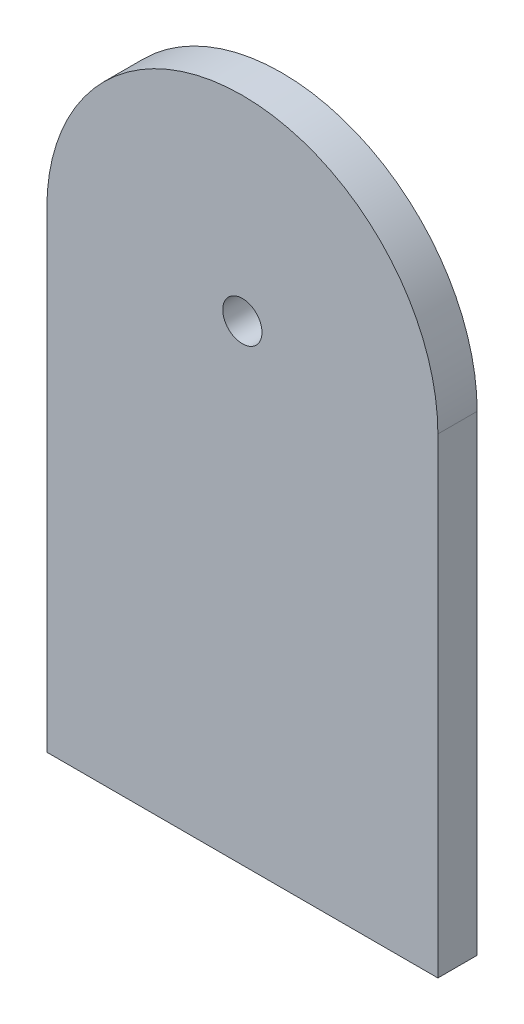
ISO-10303-21;
HEADER;
FILE_DESCRIPTION(('STEP AP214'),'2;1');
FILE_NAME('part.step','',(''),(''),'','','');
FILE_SCHEMA(('AUTOMOTIVE_DESIGN { 1 0 10303 214 1 1 1 1 }'));
ENDSEC;
DATA;
#1=APPLICATION_CONTEXT('core data for automotive mechanical design processes');
#2=APPLICATION_PROTOCOL_DEFINITION('international standard','automotive_design',2000,#1);
#3=PRODUCT_CONTEXT('',#1,'mechanical');
#4=PRODUCT('Part','Part','',(#3));
#5=PRODUCT_RELATED_PRODUCT_CATEGORY('part','',(#4));
#6=PRODUCT_DEFINITION_FORMATION('','',#4);
#7=PRODUCT_DEFINITION_CONTEXT('part definition',#1,'design');
#8=PRODUCT_DEFINITION('design','',#6,#7);
#9=PRODUCT_DEFINITION_SHAPE('','',#8);
#10=(LENGTH_UNIT() NAMED_UNIT(*) SI_UNIT(.MILLI.,.METRE.));
#11=(NAMED_UNIT(*) PLANE_ANGLE_UNIT() SI_UNIT($,.RADIAN.));
#12=(NAMED_UNIT(*) SI_UNIT($,.STERADIAN.) SOLID_ANGLE_UNIT());
#13=UNCERTAINTY_MEASURE_WITH_UNIT(LENGTH_MEASURE(1.E-05),#10,'distance_accuracy_value','');
#14=(GEOMETRIC_REPRESENTATION_CONTEXT(3) GLOBAL_UNCERTAINTY_ASSIGNED_CONTEXT((#13)) GLOBAL_UNIT_ASSIGNED_CONTEXT((#10,
#11,#12)) REPRESENTATION_CONTEXT('',''));
#15=CARTESIAN_POINT('',(0.,0.,0.));
#16=DIRECTION('',(0.,0.,1.));
#17=DIRECTION('',(1.,0.,0.));
#18=AXIS2_PLACEMENT_3D('',#15,#16,#17);
#19=CARTESIAN_POINT('',(0.,60.,-5.));
#20=DIRECTION('',(0.,0.,1.));
#21=DIRECTION('',(1.,0.,0.));
#22=AXIS2_PLACEMENT_3D('',#19,#20,#21);
#23=CYLINDRICAL_SURFACE('',#22,24.9);
#24=CARTESIAN_POINT('',(0.,60.,0.));
#25=DIRECTION('',(0.,0.,1.));
#26=DIRECTION('',(1.,0.,0.));
#27=AXIS2_PLACEMENT_3D('',#24,#25,#26);
#28=CIRCLE('',#27,24.9);
#29=CARTESIAN_POINT('',(24.9,60.,0.));
#30=VERTEX_POINT('',#29);
#31=CARTESIAN_POINT('',(-24.9,60.,0.));
#32=VERTEX_POINT('',#31);
#33=EDGE_CURVE('E100',#30,#32,#28,.T.);
#34=ORIENTED_EDGE('',*,*,#33,.F.);
#35=DIRECTION('',(0.,0.,1.));
#36=VECTOR('',#35,1.);
#37=CARTESIAN_POINT('',(24.9,60.,-5.));
#38=LINE('',#37,#36);
#39=CARTESIAN_POINT('',(24.9,60.,-5.));
#40=VERTEX_POINT('',#39);
#41=EDGE_CURVE('E11',#40,#30,#38,.T.);
#42=ORIENTED_EDGE('',*,*,#41,.F.);
#43=CARTESIAN_POINT('',(0.,60.,-5.));
#44=DIRECTION('',(0.,0.,1.));
#45=DIRECTION('',(1.,0.,0.));
#46=AXIS2_PLACEMENT_3D('',#43,#44,#45);
#47=CIRCLE('',#46,24.9);
#48=CARTESIAN_POINT('',(-24.9,60.,-5.));
#49=VERTEX_POINT('',#48);
#50=EDGE_CURVE('E92',#40,#49,#47,.T.);
#51=ORIENTED_EDGE('',*,*,#50,.T.);
#52=DIRECTION('',(0.,0.,1.));
#53=VECTOR('',#52,1.);
#54=CARTESIAN_POINT('',(-24.9,60.,-5.));
#55=LINE('',#54,#53);
#56=EDGE_CURVE('E40',#49,#32,#55,.T.);
#57=ORIENTED_EDGE('',*,*,#56,.T.);
#58=EDGE_LOOP('',(#34,#42,#51,#57));
#59=FACE_BOUND('',#58,.T.);
#60=ADVANCED_FACE('F37',(#59),#23,.T.);
#61=CARTESIAN_POINT('',(24.9,0.,-5.));
#62=DIRECTION('',(1.,0.,0.));
#63=DIRECTION('',(0.,0.,-1.));
#64=AXIS2_PLACEMENT_3D('',#61,#62,#63);
#65=PLANE('',#64);
#66=DIRECTION('',(0.,1.,0.));
#67=VECTOR('',#66,1.);
#68=CARTESIAN_POINT('',(24.9,0.,0.));
#69=LINE('',#68,#67);
#70=CARTESIAN_POINT('',(24.9,0.,0.));
#71=VERTEX_POINT('',#70);
#72=EDGE_CURVE('E107',#71,#30,#69,.T.);
#73=ORIENTED_EDGE('',*,*,#72,.F.);
#74=DIRECTION('',(0.,0.,1.));
#75=VECTOR('',#74,1.);
#76=CARTESIAN_POINT('',(24.9,0.,-5.));
#77=LINE('',#76,#75);
#78=CARTESIAN_POINT('',(24.9,0.,-5.));
#79=VERTEX_POINT('',#78);
#80=EDGE_CURVE('E46',#79,#71,#77,.T.);
#81=ORIENTED_EDGE('',*,*,#80,.F.);
#82=DIRECTION('',(0.,1.,0.));
#83=VECTOR('',#82,1.);
#84=CARTESIAN_POINT('',(24.9,0.,-5.));
#85=LINE('',#84,#83);
#86=EDGE_CURVE('E95',#79,#40,#85,.T.);
#87=ORIENTED_EDGE('',*,*,#86,.T.);
#88=ORIENTED_EDGE('',*,*,#41,.T.);
#89=EDGE_LOOP('',(#73,#81,#87,#88));
#90=FACE_BOUND('',#89,.T.);
#91=ADVANCED_FACE('F125',(#90),#65,.T.);
#92=CARTESIAN_POINT('',(0.,0.,-5.));
#93=DIRECTION('',(0.,-1.,0.));
#94=DIRECTION('',(0.,0.,-1.));
#95=AXIS2_PLACEMENT_3D('',#92,#93,#94);
#96=PLANE('',#95);
#97=DIRECTION('',(1.,0.,0.));
#98=VECTOR('',#97,1.);
#99=CARTESIAN_POINT('',(0.,0.,0.));
#100=LINE('',#99,#98);
#101=CARTESIAN_POINT('',(-24.9,0.,0.));
#102=VERTEX_POINT('',#101);
#103=EDGE_CURVE('E87',#102,#71,#100,.T.);
#104=ORIENTED_EDGE('',*,*,#103,.F.);
#105=DIRECTION('',(0.,0.,1.));
#106=VECTOR('',#105,1.);
#107=CARTESIAN_POINT('',(-24.9,0.,-5.));
#108=LINE('',#107,#106);
#109=CARTESIAN_POINT('',(-24.9,0.,-5.));
#110=VERTEX_POINT('',#109);
#111=EDGE_CURVE('E83',#110,#102,#108,.T.);
#112=ORIENTED_EDGE('',*,*,#111,.F.);
#113=DIRECTION('',(1.,0.,0.));
#114=VECTOR('',#113,1.);
#115=CARTESIAN_POINT('',(0.,0.,-5.));
#116=LINE('',#115,#114);
#117=EDGE_CURVE('E85',#110,#79,#116,.T.);
#118=ORIENTED_EDGE('',*,*,#117,.T.);
#119=ORIENTED_EDGE('',*,*,#80,.T.);
#120=EDGE_LOOP('',(#104,#112,#118,#119));
#121=FACE_BOUND('',#120,.T.);
#122=ADVANCED_FACE('F84',(#121),#96,.T.);
#123=CARTESIAN_POINT('',(-24.9,0.,-5.));
#124=DIRECTION('',(1.,0.,0.));
#125=DIRECTION('',(0.,0.,-1.));
#126=AXIS2_PLACEMENT_3D('',#123,#124,#125);
#127=PLANE('',#126);
#128=DIRECTION('',(0.,1.,0.));
#129=VECTOR('',#128,1.);
#130=CARTESIAN_POINT('',(-24.9,0.,0.));
#131=LINE('',#130,#129);
#132=EDGE_CURVE('E103',#102,#32,#131,.T.);
#133=ORIENTED_EDGE('',*,*,#132,.T.);
#134=ORIENTED_EDGE('',*,*,#56,.F.);
#135=DIRECTION('',(0.,1.,0.));
#136=VECTOR('',#135,1.);
#137=CARTESIAN_POINT('',(-24.9,0.,-5.));
#138=LINE('',#137,#136);
#139=EDGE_CURVE('E80',#110,#49,#138,.T.);
#140=ORIENTED_EDGE('',*,*,#139,.F.);
#141=ORIENTED_EDGE('',*,*,#111,.T.);
#142=EDGE_LOOP('',(#133,#134,#140,#141));
#143=FACE_BOUND('',#142,.T.);
#144=ADVANCED_FACE('F91',(#143),#127,.F.);
#145=CARTESIAN_POINT('',(0.,0.,-5.));
#146=DIRECTION('',(0.,0.,1.));
#147=DIRECTION('',(1.,0.,0.));
#148=AXIS2_PLACEMENT_3D('',#145,#146,#147);
#149=PLANE('',#148);
#150=CARTESIAN_POINT('',(0.,60.,-5.));
#151=DIRECTION('',(0.,0.,1.));
#152=DIRECTION('',(1.,0.,0.));
#153=AXIS2_PLACEMENT_3D('',#150,#151,#152);
#154=CIRCLE('',#153,2.5);
#155=CARTESIAN_POINT('',(2.5,60.,-5.));
#156=VERTEX_POINT('',#155);
#157=EDGE_CURVE('E104',#156,#156,#154,.T.);
#158=ORIENTED_EDGE('',*,*,#157,.T.);
#159=EDGE_LOOP('',(#158));
#160=FACE_BOUND('',#159,.T.);
#161=ORIENTED_EDGE('',*,*,#50,.F.);
#162=ORIENTED_EDGE('',*,*,#86,.F.);
#163=ORIENTED_EDGE('',*,*,#117,.F.);
#164=ORIENTED_EDGE('',*,*,#139,.T.);
#165=EDGE_LOOP('',(#161,#162,#163,#164));
#166=FACE_BOUND('',#165,.T.);
#167=ADVANCED_FACE('F94',(#160,#166),#149,.F.);
#168=CARTESIAN_POINT('',(0.,0.,0.));
#169=DIRECTION('',(0.,0.,1.));
#170=DIRECTION('',(1.,0.,0.));
#171=AXIS2_PLACEMENT_3D('',#168,#169,#170);
#172=PLANE('',#171);
#173=CARTESIAN_POINT('',(0.,60.,0.));
#174=DIRECTION('',(0.,0.,1.));
#175=DIRECTION('',(1.,0.,0.));
#176=AXIS2_PLACEMENT_3D('',#173,#174,#175);
#177=CIRCLE('',#176,2.5);
#178=CARTESIAN_POINT('',(2.5,60.,0.));
#179=VERTEX_POINT('',#178);
#180=EDGE_CURVE('E114',#179,#179,#177,.T.);
#181=ORIENTED_EDGE('',*,*,#180,.F.);
#182=EDGE_LOOP('',(#181));
#183=FACE_BOUND('',#182,.T.);
#184=ORIENTED_EDGE('',*,*,#33,.T.);
#185=ORIENTED_EDGE('',*,*,#132,.F.);
#186=ORIENTED_EDGE('',*,*,#103,.T.);
#187=ORIENTED_EDGE('',*,*,#72,.T.);
#188=EDGE_LOOP('',(#184,#185,#186,#187));
#189=FACE_BOUND('',#188,.T.);
#190=ADVANCED_FACE('F121',(#183,#189),#172,.T.);
#191=CARTESIAN_POINT('',(0.,60.,-50.));
#192=DIRECTION('',(0.,0.,1.));
#193=DIRECTION('',(1.,0.,0.));
#194=AXIS2_PLACEMENT_3D('',#191,#192,#193);
#195=CYLINDRICAL_SURFACE('',#194,2.5);
#196=ORIENTED_EDGE('',*,*,#180,.T.);
#197=EDGE_LOOP('',(#196));
#198=FACE_BOUND('',#197,.T.);
#199=ORIENTED_EDGE('',*,*,#157,.F.);
#200=EDGE_LOOP('',(#199));
#201=FACE_BOUND('',#200,.T.);
#202=ADVANCED_FACE('F118',(#198,#201),#195,.F.);
#203=CLOSED_SHELL('',(#60,#91,#122,#144,#167,#190,#202));
#204=MANIFOLD_SOLID_BREP('B2',#203);
#205=ADVANCED_BREP_SHAPE_REPRESENTATION('',(#18,#204),#14);
#206=SHAPE_DEFINITION_REPRESENTATION(#9,#205);
ENDSEC;
END-ISO-10303-21;
